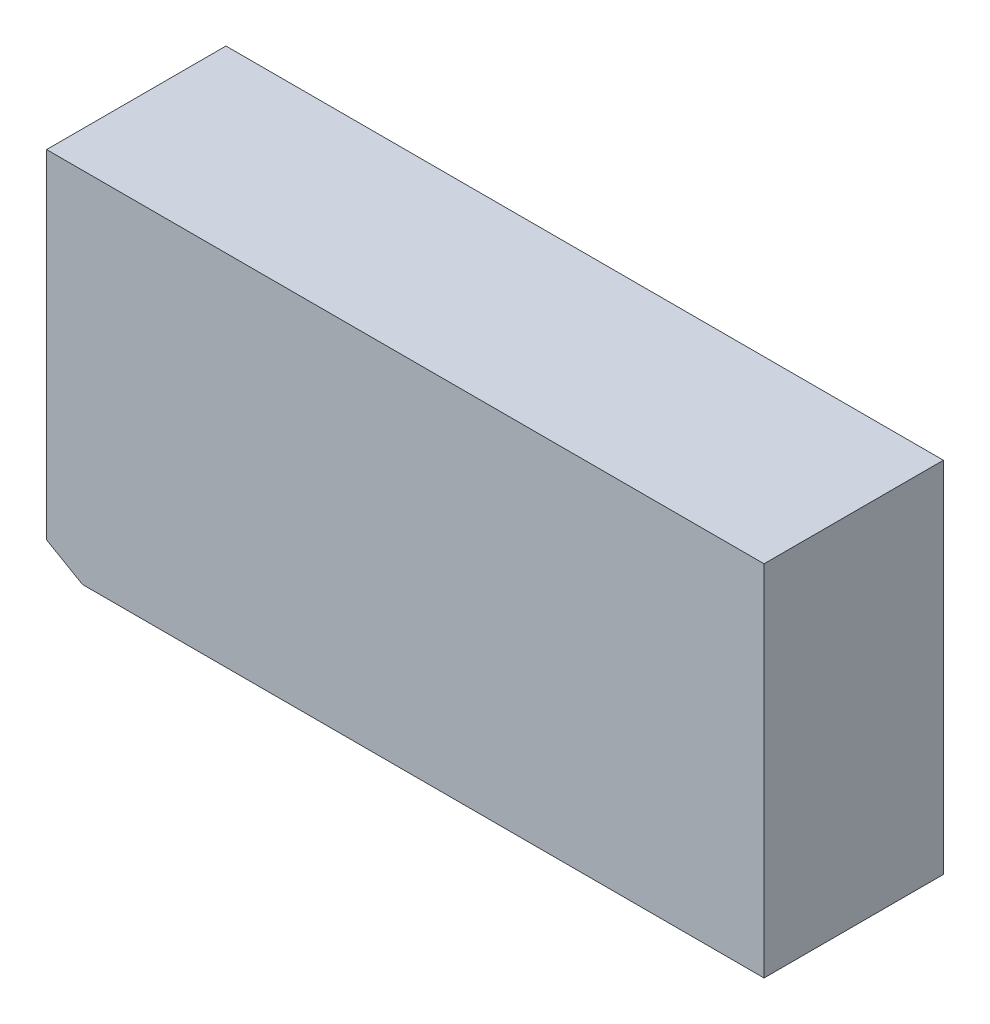
ISO-10303-21;
HEADER;
FILE_DESCRIPTION(('STEP AP214'),'2;1');
FILE_NAME('part.step','',(''),(''),'','','');
FILE_SCHEMA(('AUTOMOTIVE_DESIGN { 1 0 10303 214 1 1 1 1 }'));
ENDSEC;
DATA;
#1=APPLICATION_CONTEXT('core data for automotive mechanical design processes');
#2=APPLICATION_PROTOCOL_DEFINITION('international standard','automotive_design',2000,#1);
#3=PRODUCT_CONTEXT('',#1,'mechanical');
#4=PRODUCT('Part','Part','',(#3));
#5=PRODUCT_RELATED_PRODUCT_CATEGORY('part','',(#4));
#6=PRODUCT_DEFINITION_FORMATION('','',#4);
#7=PRODUCT_DEFINITION_CONTEXT('part definition',#1,'design');
#8=PRODUCT_DEFINITION('design','',#6,#7);
#9=PRODUCT_DEFINITION_SHAPE('','',#8);
#10=(LENGTH_UNIT() NAMED_UNIT(*) SI_UNIT(.MILLI.,.METRE.));
#11=(NAMED_UNIT(*) PLANE_ANGLE_UNIT() SI_UNIT($,.RADIAN.));
#12=(NAMED_UNIT(*) SI_UNIT($,.STERADIAN.) SOLID_ANGLE_UNIT());
#13=UNCERTAINTY_MEASURE_WITH_UNIT(LENGTH_MEASURE(1.E-05),#10,'distance_accuracy_value','');
#14=(GEOMETRIC_REPRESENTATION_CONTEXT(3) GLOBAL_UNCERTAINTY_ASSIGNED_CONTEXT((#13)) GLOBAL_UNIT_ASSIGNED_CONTEXT((#10,
#11,#12)) REPRESENTATION_CONTEXT('',''));
#15=CARTESIAN_POINT('',(0.,0.,0.));
#16=DIRECTION('',(0.,0.,1.));
#17=DIRECTION('',(1.,0.,0.));
#18=AXIS2_PLACEMENT_3D('',#15,#16,#17);
#19=CARTESIAN_POINT('',(0.,20.,10.));
#20=DIRECTION('',(1.,0.,0.));
#21=DIRECTION('',(0.,0.,-1.));
#22=AXIS2_PLACEMENT_3D('',#19,#20,#21);
#23=PLANE('',#22);
#24=DIRECTION('',(0.,-1.,0.));
#25=VECTOR('',#24,1.);
#26=CARTESIAN_POINT('',(0.,20.,0.));
#27=LINE('',#26,#25);
#28=CARTESIAN_POINT('',(0.,20.,0.));
#29=VERTEX_POINT('',#28);
#30=CARTESIAN_POINT('',(0.,1.15470053837926,0.));
#31=VERTEX_POINT('',#30);
#32=EDGE_CURVE('E120',#29,#31,#27,.T.);
#33=ORIENTED_EDGE('',*,*,#32,.T.);
#34=DIRECTION('',(0.,0.,1.));
#35=VECTOR('',#34,1.);
#36=CARTESIAN_POINT('',(0.,1.15470053837926,10.));
#37=LINE('',#36,#35);
#38=CARTESIAN_POINT('',(0.,1.15470053837926,10.));
#39=VERTEX_POINT('',#38);
#40=EDGE_CURVE('E52',#31,#39,#37,.T.);
#41=ORIENTED_EDGE('',*,*,#40,.T.);
#42=DIRECTION('',(0.,-1.,0.));
#43=VECTOR('',#42,1.);
#44=CARTESIAN_POINT('',(0.,20.,10.));
#45=LINE('',#44,#43);
#46=CARTESIAN_POINT('',(0.,20.,10.));
#47=VERTEX_POINT('',#46);
#48=EDGE_CURVE('E100',#47,#39,#45,.T.);
#49=ORIENTED_EDGE('',*,*,#48,.F.);
#50=DIRECTION('',(0.,0.,-1.));
#51=VECTOR('',#50,1.);
#52=CARTESIAN_POINT('',(0.,20.,10.));
#53=LINE('',#52,#51);
#54=EDGE_CURVE('E116',#47,#29,#53,.T.);
#55=ORIENTED_EDGE('',*,*,#54,.T.);
#56=EDGE_LOOP('',(#33,#41,#49,#55));
#57=FACE_BOUND('',#56,.T.);
#58=ADVANCED_FACE('F43',(#57),#23,.F.);
#59=CARTESIAN_POINT('',(0.,0.,10.));
#60=DIRECTION('',(0.,1.,0.));
#61=DIRECTION('',(0.,0.,1.));
#62=AXIS2_PLACEMENT_3D('',#59,#60,#61);
#63=PLANE('',#62);
#64=DIRECTION('',(1.,0.,0.));
#65=VECTOR('',#64,1.);
#66=CARTESIAN_POINT('',(0.,0.,10.));
#67=LINE('',#66,#65);
#68=CARTESIAN_POINT('',(1.99999999999999,0.,10.));
#69=VERTEX_POINT('',#68);
#70=CARTESIAN_POINT('',(40.,0.,10.));
#71=VERTEX_POINT('',#70);
#72=EDGE_CURVE('E90',#69,#71,#67,.T.);
#73=ORIENTED_EDGE('',*,*,#72,.F.);
#74=DIRECTION('',(0.,0.,-1.));
#75=VECTOR('',#74,1.);
#76=CARTESIAN_POINT('',(1.99999999999999,0.,10.));
#77=LINE('',#76,#75);
#78=CARTESIAN_POINT('',(1.99999999999999,0.,0.));
#79=VERTEX_POINT('',#78);
#80=EDGE_CURVE('E108',#69,#79,#77,.T.);
#81=ORIENTED_EDGE('',*,*,#80,.T.);
#82=DIRECTION('',(1.,0.,0.));
#83=VECTOR('',#82,1.);
#84=CARTESIAN_POINT('',(0.,0.,0.));
#85=LINE('',#84,#83);
#86=CARTESIAN_POINT('',(40.,0.,0.));
#87=VERTEX_POINT('',#86);
#88=EDGE_CURVE('E105',#79,#87,#85,.T.);
#89=ORIENTED_EDGE('',*,*,#88,.T.);
#90=DIRECTION('',(0.,0.,-1.));
#91=VECTOR('',#90,1.);
#92=CARTESIAN_POINT('',(40.,0.,10.));
#93=LINE('',#92,#91);
#94=EDGE_CURVE('E103',#71,#87,#93,.T.);
#95=ORIENTED_EDGE('',*,*,#94,.F.);
#96=EDGE_LOOP('',(#73,#81,#89,#95));
#97=FACE_BOUND('',#96,.T.);
#98=ADVANCED_FACE('F104',(#97),#63,.F.);
#99=CARTESIAN_POINT('',(40.,0.,10.));
#100=DIRECTION('',(-1.,0.,0.));
#101=DIRECTION('',(0.,0.,1.));
#102=AXIS2_PLACEMENT_3D('',#99,#100,#101);
#103=PLANE('',#102);
#104=DIRECTION('',(0.,1.,0.));
#105=VECTOR('',#104,1.);
#106=CARTESIAN_POINT('',(40.,0.,0.));
#107=LINE('',#106,#105);
#108=CARTESIAN_POINT('',(40.,20.,0.));
#109=VERTEX_POINT('',#108);
#110=EDGE_CURVE('E123',#87,#109,#107,.T.);
#111=ORIENTED_EDGE('',*,*,#110,.T.);
#112=DIRECTION('',(0.,0.,-1.));
#113=VECTOR('',#112,1.);
#114=CARTESIAN_POINT('',(40.,20.,10.));
#115=LINE('',#114,#113);
#116=CARTESIAN_POINT('',(40.,20.,10.));
#117=VERTEX_POINT('',#116);
#118=EDGE_CURVE('E109',#117,#109,#115,.T.);
#119=ORIENTED_EDGE('',*,*,#118,.F.);
#120=DIRECTION('',(0.,1.,0.));
#121=VECTOR('',#120,1.);
#122=CARTESIAN_POINT('',(40.,0.,10.));
#123=LINE('',#122,#121);
#124=EDGE_CURVE('E94',#71,#117,#123,.T.);
#125=ORIENTED_EDGE('',*,*,#124,.F.);
#126=ORIENTED_EDGE('',*,*,#94,.T.);
#127=EDGE_LOOP('',(#111,#119,#125,#126));
#128=FACE_BOUND('',#127,.T.);
#129=ADVANCED_FACE('F111',(#128),#103,.F.);
#130=CARTESIAN_POINT('',(40.,20.,10.));
#131=DIRECTION('',(0.,-1.,0.));
#132=DIRECTION('',(0.,0.,-1.));
#133=AXIS2_PLACEMENT_3D('',#130,#131,#132);
#134=PLANE('',#133);
#135=DIRECTION('',(-1.,0.,0.));
#136=VECTOR('',#135,1.);
#137=CARTESIAN_POINT('',(40.,20.,0.));
#138=LINE('',#137,#136);
#139=EDGE_CURVE('E125',#109,#29,#138,.T.);
#140=ORIENTED_EDGE('',*,*,#139,.T.);
#141=ORIENTED_EDGE('',*,*,#54,.F.);
#142=DIRECTION('',(-1.,0.,0.));
#143=VECTOR('',#142,1.);
#144=CARTESIAN_POINT('',(40.,20.,10.));
#145=LINE('',#144,#143);
#146=EDGE_CURVE('E114',#117,#47,#145,.T.);
#147=ORIENTED_EDGE('',*,*,#146,.F.);
#148=ORIENTED_EDGE('',*,*,#118,.T.);
#149=EDGE_LOOP('',(#140,#141,#147,#148));
#150=FACE_BOUND('',#149,.T.);
#151=ADVANCED_FACE('F135',(#150),#134,.F.);
#152=CARTESIAN_POINT('',(0.,0.,10.));
#153=DIRECTION('',(0.,0.,1.));
#154=DIRECTION('',(1.,0.,0.));
#155=AXIS2_PLACEMENT_3D('',#152,#153,#154);
#156=PLANE('',#155);
#157=ORIENTED_EDGE('',*,*,#48,.T.);
#158=DIRECTION('',(-0.866025403784437,0.500000000000004,0.));
#159=VECTOR('',#158,1.);
#160=CARTESIAN_POINT('',(0.500000000000004,0.866025403784438,10.));
#161=LINE('',#160,#159);
#162=EDGE_CURVE('E11',#39,#69,#161,.F.);
#163=ORIENTED_EDGE('',*,*,#162,.T.);
#164=ORIENTED_EDGE('',*,*,#72,.T.);
#165=ORIENTED_EDGE('',*,*,#124,.T.);
#166=ORIENTED_EDGE('',*,*,#146,.T.);
#167=EDGE_LOOP('',(#157,#163,#164,#165,#166));
#168=FACE_BOUND('',#167,.T.);
#169=ADVANCED_FACE('F92',(#168),#156,.T.);
#170=CARTESIAN_POINT('',(0.,0.,0.));
#171=DIRECTION('',(0.,0.,1.));
#172=DIRECTION('',(1.,0.,0.));
#173=AXIS2_PLACEMENT_3D('',#170,#171,#172);
#174=PLANE('',#173);
#175=ORIENTED_EDGE('',*,*,#88,.F.);
#176=DIRECTION('',(0.866025403784437,-0.500000000000004,0.));
#177=VECTOR('',#176,1.);
#178=CARTESIAN_POINT('',(1.99999999999999,0.,0.));
#179=LINE('',#178,#177);
#180=EDGE_CURVE('E66',#79,#31,#179,.F.);
#181=ORIENTED_EDGE('',*,*,#180,.T.);
#182=ORIENTED_EDGE('',*,*,#32,.F.);
#183=ORIENTED_EDGE('',*,*,#139,.F.);
#184=ORIENTED_EDGE('',*,*,#110,.F.);
#185=EDGE_LOOP('',(#175,#181,#182,#183,#184));
#186=FACE_BOUND('',#185,.T.);
#187=ADVANCED_FACE('F132',(#186),#174,.F.);
#188=CARTESIAN_POINT('',(1.99999999999999,0.,10.));
#189=DIRECTION('',(0.500000000000004,0.866025403784437,0.));
#190=DIRECTION('',(0.,0.,-1.));
#191=AXIS2_PLACEMENT_3D('',#188,#189,#190);
#192=PLANE('',#191);
#193=ORIENTED_EDGE('',*,*,#162,.F.);
#194=ORIENTED_EDGE('',*,*,#40,.F.);
#195=ORIENTED_EDGE('',*,*,#180,.F.);
#196=ORIENTED_EDGE('',*,*,#80,.F.);
#197=EDGE_LOOP('',(#193,#194,#195,#196));
#198=FACE_BOUND('',#197,.T.);
#199=ADVANCED_FACE('F46',(#198),#192,.F.);
#200=CLOSED_SHELL('',(#58,#98,#129,#151,#169,#187,#199));
#201=MANIFOLD_SOLID_BREP('B2',#200);
#202=ADVANCED_BREP_SHAPE_REPRESENTATION('',(#18,#201),#14);
#203=SHAPE_DEFINITION_REPRESENTATION(#9,#202);
ENDSEC;
END-ISO-10303-21;
